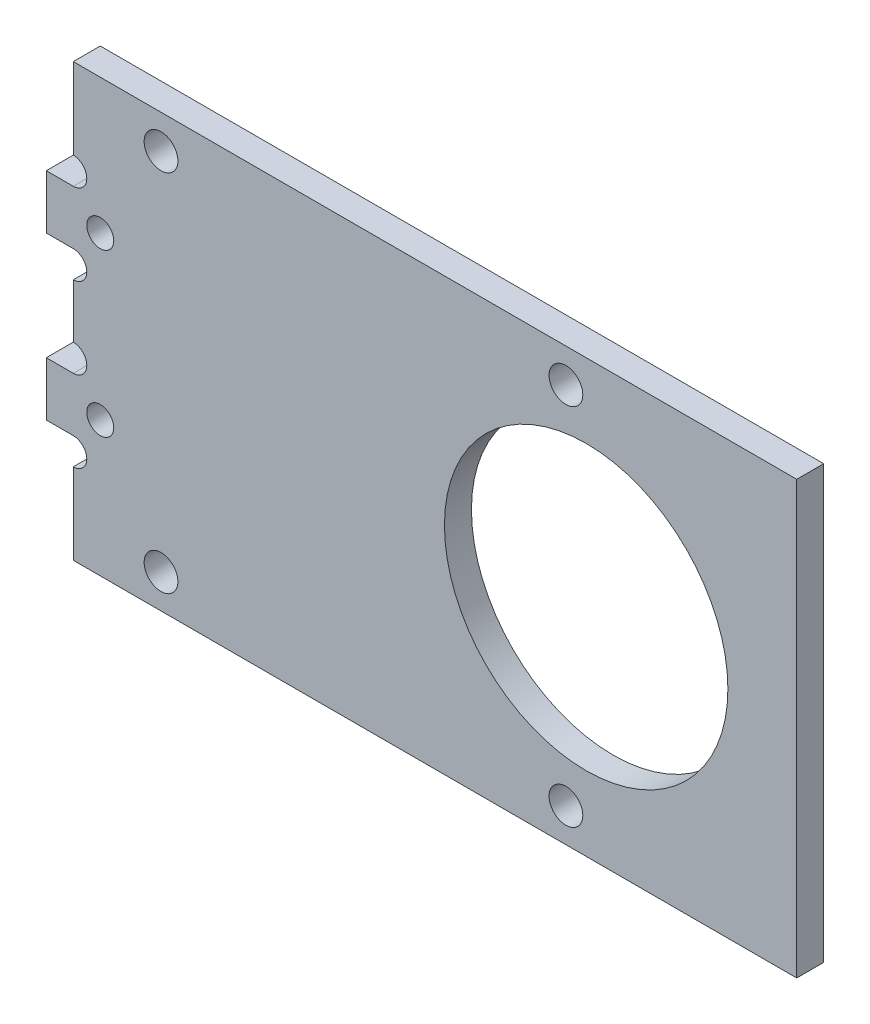
ISO-10303-21;
HEADER;
FILE_DESCRIPTION(('STEP AP214'),'2;1');
FILE_NAME('part.step','',(''),(''),'','','');
FILE_SCHEMA(('AUTOMOTIVE_DESIGN { 1 0 10303 214 1 1 1 1 }'));
ENDSEC;
DATA;
#1=APPLICATION_CONTEXT('core data for automotive mechanical design processes');
#2=APPLICATION_PROTOCOL_DEFINITION('international standard','automotive_design',2000,#1);
#3=PRODUCT_CONTEXT('',#1,'mechanical');
#4=PRODUCT('Part','Part','',(#3));
#5=PRODUCT_RELATED_PRODUCT_CATEGORY('part','',(#4));
#6=PRODUCT_DEFINITION_FORMATION('','',#4);
#7=PRODUCT_DEFINITION_CONTEXT('part definition',#1,'design');
#8=PRODUCT_DEFINITION('design','',#6,#7);
#9=PRODUCT_DEFINITION_SHAPE('','',#8);
#10=(LENGTH_UNIT() NAMED_UNIT(*) SI_UNIT(.MILLI.,.METRE.));
#11=(NAMED_UNIT(*) PLANE_ANGLE_UNIT() SI_UNIT($,.RADIAN.));
#12=(NAMED_UNIT(*) SI_UNIT($,.STERADIAN.) SOLID_ANGLE_UNIT());
#13=UNCERTAINTY_MEASURE_WITH_UNIT(LENGTH_MEASURE(1.E-05),#10,'distance_accuracy_value','');
#14=(GEOMETRIC_REPRESENTATION_CONTEXT(3) GLOBAL_UNCERTAINTY_ASSIGNED_CONTEXT((#13)) GLOBAL_UNIT_ASSIGNED_CONTEXT((#10,
#11,#12)) REPRESENTATION_CONTEXT('',''));
#15=CARTESIAN_POINT('',(0.,0.,0.));
#16=DIRECTION('',(0.,0.,1.));
#17=DIRECTION('',(1.,0.,0.));
#18=AXIS2_PLACEMENT_3D('',#15,#16,#17);
#19=CARTESIAN_POINT('',(-8.86843463568494,-9.10629075351366,2.));
#20=DIRECTION('',(0.,0.,-1.));
#21=DIRECTION('',(-1.,0.,0.));
#22=AXIS2_PLACEMENT_3D('',#19,#20,#21);
#23=PLANE('',#22);
#24=DIRECTION('',(-1.,0.,0.));
#25=VECTOR('',#24,1.);
#26=CARTESIAN_POINT('',(-8.86843463568493,15.8937092464863,2.));
#27=LINE('',#26,#25);
#28=CARTESIAN_POINT('',(44.7315653643151,15.8937092464863,2.));
#29=VERTEX_POINT('',#28);
#30=CARTESIAN_POINT('',(-8.86843463568493,15.8937092464863,2.));
#31=VERTEX_POINT('',#30);
#32=EDGE_CURVE('E208',#29,#31,#27,.T.);
#33=ORIENTED_EDGE('',*,*,#32,.T.);
#34=DIRECTION('',(0.,-1.,0.));
#35=VECTOR('',#34,1.);
#36=CARTESIAN_POINT('',(-8.86843463568494,14.8937092464863,2.));
#37=LINE('',#36,#35);
#38=CARTESIAN_POINT('',(-8.86843463568494,9.89370924648633,2.));
#39=VERTEX_POINT('',#38);
#40=EDGE_CURVE('E112',#31,#39,#37,.T.);
#41=ORIENTED_EDGE('',*,*,#40,.T.);
#42=CARTESIAN_POINT('',(-8.86843463568494,8.89370924648634,2.));
#43=DIRECTION('',(0.,0.,-1.));
#44=DIRECTION('',(1.,0.,0.));
#45=AXIS2_PLACEMENT_3D('',#42,#43,#44);
#46=CIRCLE('',#45,1.);
#47=CARTESIAN_POINT('',(-8.86843463568494,7.89370924648634,2.));
#48=VERTEX_POINT('',#47);
#49=EDGE_CURVE('E248',#39,#48,#46,.T.);
#50=ORIENTED_EDGE('',*,*,#49,.T.);
#51=DIRECTION('',(-1.,0.,0.));
#52=VECTOR('',#51,1.);
#53=CARTESIAN_POINT('',(-8.86843463568494,7.89370924648634,2.));
#54=LINE('',#53,#52);
#55=CARTESIAN_POINT('',(-10.8684346356849,7.89370924648634,2.));
#56=VERTEX_POINT('',#55);
#57=EDGE_CURVE('E265',#48,#56,#54,.T.);
#58=ORIENTED_EDGE('',*,*,#57,.T.);
#59=DIRECTION('',(0.,-1.,0.));
#60=VECTOR('',#59,1.);
#61=CARTESIAN_POINT('',(-10.8684346356849,7.89370924648634,2.));
#62=LINE('',#61,#60);
#63=CARTESIAN_POINT('',(-10.8684346356849,3.89370924648634,2.));
#64=VERTEX_POINT('',#63);
#65=EDGE_CURVE('E262',#56,#64,#62,.T.);
#66=ORIENTED_EDGE('',*,*,#65,.T.);
#67=DIRECTION('',(1.,0.,0.));
#68=VECTOR('',#67,1.);
#69=CARTESIAN_POINT('',(-8.86843463568494,3.89370924648634,2.));
#70=LINE('',#69,#68);
#71=CARTESIAN_POINT('',(-8.86843463568494,3.89370924648634,2.));
#72=VERTEX_POINT('',#71);
#73=EDGE_CURVE('E264',#64,#72,#70,.T.);
#74=ORIENTED_EDGE('',*,*,#73,.T.);
#75=CARTESIAN_POINT('',(-8.86843463568494,2.89370924648634,2.));
#76=DIRECTION('',(0.,0.,-1.));
#77=DIRECTION('',(-1.,0.,0.));
#78=AXIS2_PLACEMENT_3D('',#75,#76,#77);
#79=CIRCLE('',#78,1.);
#80=CARTESIAN_POINT('',(-8.86843463568494,1.89370924648634,2.));
#81=VERTEX_POINT('',#80);
#82=EDGE_CURVE('E267',#72,#81,#79,.T.);
#83=ORIENTED_EDGE('',*,*,#82,.T.);
#84=DIRECTION('',(0.,-1.,0.));
#85=VECTOR('',#84,1.);
#86=CARTESIAN_POINT('',(-8.86843463568494,1.89370924648634,2.));
#87=LINE('',#86,#85);
#88=CARTESIAN_POINT('',(-8.86843463568494,-2.10629075351366,2.));
#89=VERTEX_POINT('',#88);
#90=EDGE_CURVE('E273',#81,#89,#87,.T.);
#91=ORIENTED_EDGE('',*,*,#90,.T.);
#92=CARTESIAN_POINT('',(-8.86843463568494,-3.10629075351366,2.));
#93=DIRECTION('',(0.,0.,-1.));
#94=DIRECTION('',(1.,0.,0.));
#95=AXIS2_PLACEMENT_3D('',#92,#93,#94);
#96=CIRCLE('',#95,1.);
#97=CARTESIAN_POINT('',(-8.86843463568494,-4.10629075351366,2.));
#98=VERTEX_POINT('',#97);
#99=EDGE_CURVE('E275',#89,#98,#96,.T.);
#100=ORIENTED_EDGE('',*,*,#99,.T.);
#101=DIRECTION('',(-1.,0.,0.));
#102=VECTOR('',#101,1.);
#103=CARTESIAN_POINT('',(-8.86843463568494,-4.10629075351366,2.));
#104=LINE('',#103,#102);
#105=CARTESIAN_POINT('',(-10.8684346356849,-4.10629075351366,2.));
#106=VERTEX_POINT('',#105);
#107=EDGE_CURVE('E277',#98,#106,#104,.T.);
#108=ORIENTED_EDGE('',*,*,#107,.T.);
#109=DIRECTION('',(0.,-1.,0.));
#110=VECTOR('',#109,1.);
#111=CARTESIAN_POINT('',(-10.8684346356849,-4.10629075351366,2.));
#112=LINE('',#111,#110);
#113=CARTESIAN_POINT('',(-10.8684346356849,-8.10629075351366,2.));
#114=VERTEX_POINT('',#113);
#115=EDGE_CURVE('E279',#106,#114,#112,.T.);
#116=ORIENTED_EDGE('',*,*,#115,.T.);
#117=DIRECTION('',(1.,0.,0.));
#118=VECTOR('',#117,1.);
#119=CARTESIAN_POINT('',(-8.86843463568494,-8.10629075351366,2.));
#120=LINE('',#119,#118);
#121=CARTESIAN_POINT('',(-8.86843463568494,-8.10629075351366,2.));
#122=VERTEX_POINT('',#121);
#123=EDGE_CURVE('E281',#114,#122,#120,.T.);
#124=ORIENTED_EDGE('',*,*,#123,.T.);
#125=CARTESIAN_POINT('',(-8.86843463568494,-9.10629075351366,2.));
#126=DIRECTION('',(0.,0.,-1.));
#127=DIRECTION('',(-1.,0.,0.));
#128=AXIS2_PLACEMENT_3D('',#125,#126,#127);
#129=CIRCLE('',#128,0.999999999999999);
#130=CARTESIAN_POINT('',(-8.86843463568494,-10.1062907535137,2.));
#131=VERTEX_POINT('',#130);
#132=EDGE_CURVE('E156',#122,#131,#129,.T.);
#133=ORIENTED_EDGE('',*,*,#132,.T.);
#134=DIRECTION('',(0.,-1.,0.));
#135=VECTOR('',#134,1.);
#136=CARTESIAN_POINT('',(-8.86843463568494,-10.1062907535137,2.));
#137=LINE('',#136,#135);
#138=CARTESIAN_POINT('',(-8.86843463568493,-16.1062907535137,2.));
#139=VERTEX_POINT('',#138);
#140=EDGE_CURVE('E149',#131,#139,#137,.T.);
#141=ORIENTED_EDGE('',*,*,#140,.T.);
#142=DIRECTION('',(1.,0.,0.));
#143=VECTOR('',#142,1.);
#144=CARTESIAN_POINT('',(-8.86843463568493,-16.1062907535137,2.));
#145=LINE('',#144,#143);
#146=CARTESIAN_POINT('',(44.7315653643151,-16.1062907535137,2.));
#147=VERTEX_POINT('',#146);
#148=EDGE_CURVE('E153',#139,#147,#145,.T.);
#149=ORIENTED_EDGE('',*,*,#148,.T.);
#150=DIRECTION('',(0.,1.,0.));
#151=VECTOR('',#150,1.);
#152=CARTESIAN_POINT('',(44.7315653643151,-15.1062907535137,2.));
#153=LINE('',#152,#151);
#154=EDGE_CURVE('E49',#147,#29,#153,.T.);
#155=ORIENTED_EDGE('',*,*,#154,.T.);
#156=EDGE_LOOP('',(#33,#41,#50,#58,#66,#74,#83,#91,#100,#108,#116,#124,#133,#141,#149,#155));
#157=FACE_BOUND('',#156,.T.);
#158=CARTESIAN_POINT('',(-6.86843463568493,5.89370924648634,2.));
#159=DIRECTION('',(0.,0.,1.));
#160=DIRECTION('',(1.,0.,0.));
#161=AXIS2_PLACEMENT_3D('',#158,#159,#160);
#162=CIRCLE('',#161,1.);
#163=CARTESIAN_POINT('',(-5.86843463568493,5.89370924648634,2.));
#164=VERTEX_POINT('',#163);
#165=EDGE_CURVE('E180',#164,#164,#162,.T.);
#166=ORIENTED_EDGE('',*,*,#165,.F.);
#167=EDGE_LOOP('',(#166));
#168=FACE_BOUND('',#167,.T.);
#169=CARTESIAN_POINT('',(29.1315653643151,-0.106290753513656,2.));
#170=DIRECTION('',(0.,0.,1.));
#171=DIRECTION('',(1.,0.,0.));
#172=AXIS2_PLACEMENT_3D('',#169,#170,#171);
#173=CIRCLE('',#172,10.5);
#174=CARTESIAN_POINT('',(39.6315653643151,-0.106290753513656,2.));
#175=VERTEX_POINT('',#174);
#176=EDGE_CURVE('E305',#175,#175,#173,.T.);
#177=ORIENTED_EDGE('',*,*,#176,.F.);
#178=EDGE_LOOP('',(#177));
#179=FACE_BOUND('',#178,.T.);
#180=CARTESIAN_POINT('',(-6.86843463568493,-6.10629075351366,2.));
#181=DIRECTION('',(0.,0.,1.));
#182=DIRECTION('',(1.,0.,0.));
#183=AXIS2_PLACEMENT_3D('',#180,#181,#182);
#184=CIRCLE('',#183,1.);
#185=CARTESIAN_POINT('',(-5.86843463568493,-6.10629075351366,2.));
#186=VERTEX_POINT('',#185);
#187=EDGE_CURVE('E311',#186,#186,#184,.T.);
#188=ORIENTED_EDGE('',*,*,#187,.F.);
#189=EDGE_LOOP('',(#188));
#190=FACE_BOUND('',#189,.T.);
#191=CARTESIAN_POINT('',(-2.36843463568494,13.3937092464863,2.));
#192=DIRECTION('',(0.,0.,1.));
#193=DIRECTION('',(1.,0.,0.));
#194=AXIS2_PLACEMENT_3D('',#191,#192,#193);
#195=CIRCLE('',#194,1.25);
#196=CARTESIAN_POINT('',(-1.11843463568494,13.3937092464863,2.));
#197=VERTEX_POINT('',#196);
#198=EDGE_CURVE('E317',#197,#197,#195,.T.);
#199=ORIENTED_EDGE('',*,*,#198,.F.);
#200=EDGE_LOOP('',(#199));
#201=FACE_BOUND('',#200,.T.);
#202=CARTESIAN_POINT('',(-2.36843463568493,-13.6062907535137,2.));
#203=DIRECTION('',(0.,0.,1.));
#204=DIRECTION('',(1.,0.,0.));
#205=AXIS2_PLACEMENT_3D('',#202,#203,#204);
#206=CIRCLE('',#205,1.25);
#207=CARTESIAN_POINT('',(-1.11843463568493,-13.6062907535137,2.));
#208=VERTEX_POINT('',#207);
#209=EDGE_CURVE('E323',#208,#208,#206,.T.);
#210=ORIENTED_EDGE('',*,*,#209,.F.);
#211=EDGE_LOOP('',(#210));
#212=FACE_BOUND('',#211,.T.);
#213=CARTESIAN_POINT('',(27.6315653643151,13.3937092464863,2.));
#214=DIRECTION('',(0.,0.,1.));
#215=DIRECTION('',(1.,0.,0.));
#216=AXIS2_PLACEMENT_3D('',#213,#214,#215);
#217=CIRCLE('',#216,1.25);
#218=CARTESIAN_POINT('',(28.8815653643151,13.3937092464863,2.));
#219=VERTEX_POINT('',#218);
#220=EDGE_CURVE('E329',#219,#219,#217,.T.);
#221=ORIENTED_EDGE('',*,*,#220,.F.);
#222=EDGE_LOOP('',(#221));
#223=FACE_BOUND('',#222,.T.);
#224=CARTESIAN_POINT('',(27.6315653643151,-13.6062907535137,2.));
#225=DIRECTION('',(0.,0.,1.));
#226=DIRECTION('',(1.,0.,0.));
#227=AXIS2_PLACEMENT_3D('',#224,#225,#226);
#228=CIRCLE('',#227,1.25);
#229=CARTESIAN_POINT('',(28.8815653643151,-13.6062907535137,2.));
#230=VERTEX_POINT('',#229);
#231=EDGE_CURVE('E335',#230,#230,#228,.T.);
#232=ORIENTED_EDGE('',*,*,#231,.F.);
#233=EDGE_LOOP('',(#232));
#234=FACE_BOUND('',#233,.T.);
#235=ADVANCED_FACE('F32',(#157,#168,#179,#190,#201,#212,#223,#234),#23,.F.);
#236=CARTESIAN_POINT('',(-8.86843463568494,-9.10629075351366,0.));
#237=DIRECTION('',(0.,0.,-1.));
#238=DIRECTION('',(-1.,0.,0.));
#239=AXIS2_PLACEMENT_3D('',#236,#237,#238);
#240=PLANE('',#239);
#241=CARTESIAN_POINT('',(27.6315653643151,13.3937092464863,0.));
#242=DIRECTION('',(0.,0.,1.));
#243=DIRECTION('',(1.,0.,0.));
#244=AXIS2_PLACEMENT_3D('',#241,#242,#243);
#245=CIRCLE('',#244,1.25);
#246=CARTESIAN_POINT('',(28.8815653643151,13.3937092464863,0.));
#247=VERTEX_POINT('',#246);
#248=EDGE_CURVE('E332',#247,#247,#245,.T.);
#249=ORIENTED_EDGE('',*,*,#248,.T.);
#250=EDGE_LOOP('',(#249));
#251=FACE_BOUND('',#250,.T.);
#252=CARTESIAN_POINT('',(-2.36843463568494,13.3937092464863,0.));
#253=DIRECTION('',(0.,0.,1.));
#254=DIRECTION('',(1.,0.,0.));
#255=AXIS2_PLACEMENT_3D('',#252,#253,#254);
#256=CIRCLE('',#255,1.25);
#257=CARTESIAN_POINT('',(-1.11843463568494,13.3937092464863,0.));
#258=VERTEX_POINT('',#257);
#259=EDGE_CURVE('E320',#258,#258,#256,.T.);
#260=ORIENTED_EDGE('',*,*,#259,.T.);
#261=EDGE_LOOP('',(#260));
#262=FACE_BOUND('',#261,.T.);
#263=CARTESIAN_POINT('',(29.1315653643151,-0.106290753513656,0.));
#264=DIRECTION('',(0.,0.,1.));
#265=DIRECTION('',(1.,0.,0.));
#266=AXIS2_PLACEMENT_3D('',#263,#264,#265);
#267=CIRCLE('',#266,10.5);
#268=CARTESIAN_POINT('',(39.6315653643151,-0.106290753513656,0.));
#269=VERTEX_POINT('',#268);
#270=EDGE_CURVE('E308',#269,#269,#267,.T.);
#271=ORIENTED_EDGE('',*,*,#270,.T.);
#272=EDGE_LOOP('',(#271));
#273=FACE_BOUND('',#272,.T.);
#274=DIRECTION('',(0.,-1.,0.));
#275=VECTOR('',#274,1.);
#276=CARTESIAN_POINT('',(-8.86843463568494,14.8937092464863,0.));
#277=LINE('',#276,#275);
#278=CARTESIAN_POINT('',(-8.86843463568493,15.8937092464863,0.));
#279=VERTEX_POINT('',#278);
#280=CARTESIAN_POINT('',(-8.86843463568494,9.89370924648633,0.));
#281=VERTEX_POINT('',#280);
#282=EDGE_CURVE('E177',#279,#281,#277,.T.);
#283=ORIENTED_EDGE('',*,*,#282,.F.);
#284=DIRECTION('',(-1.,0.,0.));
#285=VECTOR('',#284,1.);
#286=CARTESIAN_POINT('',(-7.86843463568494,15.8937092464863,0.));
#287=LINE('',#286,#285);
#288=CARTESIAN_POINT('',(44.7315653643151,15.8937092464863,0.));
#289=VERTEX_POINT('',#288);
#290=EDGE_CURVE('E105',#289,#279,#287,.T.);
#291=ORIENTED_EDGE('',*,*,#290,.F.);
#292=DIRECTION('',(0.,1.,0.));
#293=VECTOR('',#292,1.);
#294=CARTESIAN_POINT('',(44.7315653643151,14.8937092464863,0.));
#295=LINE('',#294,#293);
#296=CARTESIAN_POINT('',(44.7315653643151,-16.1062907535137,0.));
#297=VERTEX_POINT('',#296);
#298=EDGE_CURVE('E101',#297,#289,#295,.T.);
#299=ORIENTED_EDGE('',*,*,#298,.F.);
#300=DIRECTION('',(1.,0.,0.));
#301=VECTOR('',#300,1.);
#302=CARTESIAN_POINT('',(44.7315653643151,-16.1062907535137,0.));
#303=LINE('',#302,#301);
#304=CARTESIAN_POINT('',(-8.86843463568493,-16.1062907535137,0.));
#305=VERTEX_POINT('',#304);
#306=EDGE_CURVE('E204',#305,#297,#303,.T.);
#307=ORIENTED_EDGE('',*,*,#306,.F.);
#308=DIRECTION('',(0.,-1.,0.));
#309=VECTOR('',#308,1.);
#310=CARTESIAN_POINT('',(-8.86843463568493,-15.1062907535137,0.));
#311=LINE('',#310,#309);
#312=CARTESIAN_POINT('',(-8.86843463568494,-10.1062907535137,0.));
#313=VERTEX_POINT('',#312);
#314=EDGE_CURVE('E165',#313,#305,#311,.T.);
#315=ORIENTED_EDGE('',*,*,#314,.F.);
#316=CARTESIAN_POINT('',(-8.86843463568494,-9.10629075351366,0.));
#317=DIRECTION('',(0.,0.,-1.));
#318=DIRECTION('',(-1.,0.,0.));
#319=AXIS2_PLACEMENT_3D('',#316,#317,#318);
#320=CIRCLE('',#319,0.999999999999999);
#321=CARTESIAN_POINT('',(-8.86843463568494,-8.10629075351366,0.));
#322=VERTEX_POINT('',#321);
#323=EDGE_CURVE('E200',#322,#313,#320,.T.);
#324=ORIENTED_EDGE('',*,*,#323,.F.);
#325=DIRECTION('',(1.,0.,0.));
#326=VECTOR('',#325,1.);
#327=CARTESIAN_POINT('',(-8.86843463568494,-8.10629075351366,0.));
#328=LINE('',#327,#326);
#329=CARTESIAN_POINT('',(-10.8684346356849,-8.10629075351366,0.));
#330=VERTEX_POINT('',#329);
#331=EDGE_CURVE('E198',#330,#322,#328,.T.);
#332=ORIENTED_EDGE('',*,*,#331,.F.);
#333=DIRECTION('',(0.,-1.,0.));
#334=VECTOR('',#333,1.);
#335=CARTESIAN_POINT('',(-10.8684346356849,-4.10629075351366,0.));
#336=LINE('',#335,#334);
#337=CARTESIAN_POINT('',(-10.8684346356849,-4.10629075351366,0.));
#338=VERTEX_POINT('',#337);
#339=EDGE_CURVE('E196',#338,#330,#336,.T.);
#340=ORIENTED_EDGE('',*,*,#339,.F.);
#341=DIRECTION('',(-1.,0.,0.));
#342=VECTOR('',#341,1.);
#343=CARTESIAN_POINT('',(-8.86843463568494,-4.10629075351366,0.));
#344=LINE('',#343,#342);
#345=CARTESIAN_POINT('',(-8.86843463568494,-4.10629075351366,0.));
#346=VERTEX_POINT('',#345);
#347=EDGE_CURVE('E194',#346,#338,#344,.T.);
#348=ORIENTED_EDGE('',*,*,#347,.F.);
#349=CARTESIAN_POINT('',(-8.86843463568494,-3.10629075351366,0.));
#350=DIRECTION('',(0.,0.,-1.));
#351=DIRECTION('',(1.,0.,0.));
#352=AXIS2_PLACEMENT_3D('',#349,#350,#351);
#353=CIRCLE('',#352,1.);
#354=CARTESIAN_POINT('',(-8.86843463568494,-2.10629075351366,0.));
#355=VERTEX_POINT('',#354);
#356=EDGE_CURVE('E192',#355,#346,#353,.T.);
#357=ORIENTED_EDGE('',*,*,#356,.F.);
#358=DIRECTION('',(0.,-1.,0.));
#359=VECTOR('',#358,1.);
#360=CARTESIAN_POINT('',(-8.86843463568494,1.89370924648634,0.));
#361=LINE('',#360,#359);
#362=CARTESIAN_POINT('',(-8.86843463568494,1.89370924648634,0.));
#363=VERTEX_POINT('',#362);
#364=EDGE_CURVE('E190',#363,#355,#361,.T.);
#365=ORIENTED_EDGE('',*,*,#364,.F.);
#366=CARTESIAN_POINT('',(-8.86843463568494,2.89370924648634,0.));
#367=DIRECTION('',(0.,0.,-1.));
#368=DIRECTION('',(-1.,0.,0.));
#369=AXIS2_PLACEMENT_3D('',#366,#367,#368);
#370=CIRCLE('',#369,1.);
#371=CARTESIAN_POINT('',(-8.86843463568494,3.89370924648634,0.));
#372=VERTEX_POINT('',#371);
#373=EDGE_CURVE('E188',#372,#363,#370,.T.);
#374=ORIENTED_EDGE('',*,*,#373,.F.);
#375=DIRECTION('',(1.,0.,0.));
#376=VECTOR('',#375,1.);
#377=CARTESIAN_POINT('',(-8.86843463568494,3.89370924648634,0.));
#378=LINE('',#377,#376);
#379=CARTESIAN_POINT('',(-10.8684346356849,3.89370924648634,0.));
#380=VERTEX_POINT('',#379);
#381=EDGE_CURVE('E186',#380,#372,#378,.T.);
#382=ORIENTED_EDGE('',*,*,#381,.F.);
#383=DIRECTION('',(0.,-1.,0.));
#384=VECTOR('',#383,1.);
#385=CARTESIAN_POINT('',(-10.8684346356849,7.89370924648634,0.));
#386=LINE('',#385,#384);
#387=CARTESIAN_POINT('',(-10.8684346356849,7.89370924648634,0.));
#388=VERTEX_POINT('',#387);
#389=EDGE_CURVE('E184',#388,#380,#386,.T.);
#390=ORIENTED_EDGE('',*,*,#389,.F.);
#391=DIRECTION('',(-1.,0.,0.));
#392=VECTOR('',#391,1.);
#393=CARTESIAN_POINT('',(-8.86843463568494,7.89370924648634,0.));
#394=LINE('',#393,#392);
#395=CARTESIAN_POINT('',(-8.86843463568494,7.89370924648634,0.));
#396=VERTEX_POINT('',#395);
#397=EDGE_CURVE('E182',#396,#388,#394,.T.);
#398=ORIENTED_EDGE('',*,*,#397,.F.);
#399=CARTESIAN_POINT('',(-8.86843463568494,8.89370924648634,0.));
#400=DIRECTION('',(0.,0.,-1.));
#401=DIRECTION('',(1.,0.,0.));
#402=AXIS2_PLACEMENT_3D('',#399,#400,#401);
#403=CIRCLE('',#402,1.);
#404=EDGE_CURVE('E179',#281,#396,#403,.T.);
#405=ORIENTED_EDGE('',*,*,#404,.F.);
#406=EDGE_LOOP('',(#283,#291,#299,#307,#315,#324,#332,#340,#348,#357,#365,#374,#382,#390,#398,#405));
#407=FACE_BOUND('',#406,.T.);
#408=CARTESIAN_POINT('',(-6.86843463568493,5.89370924648634,0.));
#409=DIRECTION('',(0.,0.,1.));
#410=DIRECTION('',(1.,0.,0.));
#411=AXIS2_PLACEMENT_3D('',#408,#409,#410);
#412=CIRCLE('',#411,1.);
#413=CARTESIAN_POINT('',(-5.86843463568493,5.89370924648634,0.));
#414=VERTEX_POINT('',#413);
#415=EDGE_CURVE('E302',#414,#414,#412,.T.);
#416=ORIENTED_EDGE('',*,*,#415,.T.);
#417=EDGE_LOOP('',(#416));
#418=FACE_BOUND('',#417,.T.);
#419=CARTESIAN_POINT('',(-6.86843463568493,-6.10629075351366,0.));
#420=DIRECTION('',(0.,0.,1.));
#421=DIRECTION('',(1.,0.,0.));
#422=AXIS2_PLACEMENT_3D('',#419,#420,#421);
#423=CIRCLE('',#422,1.);
#424=CARTESIAN_POINT('',(-5.86843463568493,-6.10629075351366,0.));
#425=VERTEX_POINT('',#424);
#426=EDGE_CURVE('E314',#425,#425,#423,.T.);
#427=ORIENTED_EDGE('',*,*,#426,.T.);
#428=EDGE_LOOP('',(#427));
#429=FACE_BOUND('',#428,.T.);
#430=CARTESIAN_POINT('',(-2.36843463568493,-13.6062907535137,0.));
#431=DIRECTION('',(0.,0.,1.));
#432=DIRECTION('',(1.,0.,0.));
#433=AXIS2_PLACEMENT_3D('',#430,#431,#432);
#434=CIRCLE('',#433,1.25);
#435=CARTESIAN_POINT('',(-1.11843463568493,-13.6062907535137,0.));
#436=VERTEX_POINT('',#435);
#437=EDGE_CURVE('E326',#436,#436,#434,.T.);
#438=ORIENTED_EDGE('',*,*,#437,.T.);
#439=EDGE_LOOP('',(#438));
#440=FACE_BOUND('',#439,.T.);
#441=CARTESIAN_POINT('',(27.6315653643151,-13.6062907535137,0.));
#442=DIRECTION('',(0.,0.,1.));
#443=DIRECTION('',(1.,0.,0.));
#444=AXIS2_PLACEMENT_3D('',#441,#442,#443);
#445=CIRCLE('',#444,1.25);
#446=CARTESIAN_POINT('',(28.8815653643151,-13.6062907535137,0.));
#447=VERTEX_POINT('',#446);
#448=EDGE_CURVE('E338',#447,#447,#445,.T.);
#449=ORIENTED_EDGE('',*,*,#448,.T.);
#450=EDGE_LOOP('',(#449));
#451=FACE_BOUND('',#450,.T.);
#452=ADVANCED_FACE('F250',(#251,#262,#273,#407,#418,#429,#440,#451),#240,.T.);
#453=CARTESIAN_POINT('',(-8.86843463568494,14.8937092464863,2.));
#454=DIRECTION('',(1.,0.,0.));
#455=DIRECTION('',(0.,0.,-1.));
#456=AXIS2_PLACEMENT_3D('',#453,#454,#455);
#457=PLANE('',#456);
#458=ORIENTED_EDGE('',*,*,#282,.T.);
#459=DIRECTION('',(0.,0.,-1.));
#460=VECTOR('',#459,1.);
#461=CARTESIAN_POINT('',(-8.86843463568494,9.89370924648633,2.));
#462=LINE('',#461,#460);
#463=EDGE_CURVE('E41',#39,#281,#462,.T.);
#464=ORIENTED_EDGE('',*,*,#463,.F.);
#465=ORIENTED_EDGE('',*,*,#40,.F.);
#466=DIRECTION('',(0.,0.,-1.));
#467=VECTOR('',#466,1.);
#468=CARTESIAN_POINT('',(-8.86843463568493,15.8937092464863,2.));
#469=LINE('',#468,#467);
#470=EDGE_CURVE('E11',#31,#279,#469,.T.);
#471=ORIENTED_EDGE('',*,*,#470,.T.);
#472=EDGE_LOOP('',(#458,#464,#465,#471));
#473=FACE_BOUND('',#472,.T.);
#474=ADVANCED_FACE('F34',(#473),#457,.F.);
#475=CARTESIAN_POINT('',(-8.86843463568494,8.89370924648634,2.));
#476=DIRECTION('',(0.,0.,-1.));
#477=DIRECTION('',(-1.,0.,0.));
#478=AXIS2_PLACEMENT_3D('',#475,#476,#477);
#479=CYLINDRICAL_SURFACE('',#478,1.);
#480=ORIENTED_EDGE('',*,*,#404,.T.);
#481=DIRECTION('',(0.,0.,-1.));
#482=VECTOR('',#481,1.);
#483=CARTESIAN_POINT('',(-8.86843463568494,7.89370924648634,2.));
#484=LINE('',#483,#482);
#485=EDGE_CURVE('E240',#48,#396,#484,.T.);
#486=ORIENTED_EDGE('',*,*,#485,.F.);
#487=ORIENTED_EDGE('',*,*,#49,.F.);
#488=ORIENTED_EDGE('',*,*,#463,.T.);
#489=EDGE_LOOP('',(#480,#486,#487,#488));
#490=FACE_BOUND('',#489,.T.);
#491=ADVANCED_FACE('F246',(#490),#479,.F.);
#492=CARTESIAN_POINT('',(-8.86843463568494,7.89370924648634,2.));
#493=DIRECTION('',(0.,-1.,0.));
#494=DIRECTION('',(0.,0.,-1.));
#495=AXIS2_PLACEMENT_3D('',#492,#493,#494);
#496=PLANE('',#495);
#497=ORIENTED_EDGE('',*,*,#397,.T.);
#498=DIRECTION('',(0.,0.,-1.));
#499=VECTOR('',#498,1.);
#500=CARTESIAN_POINT('',(-10.8684346356849,7.89370924648634,2.));
#501=LINE('',#500,#499);
#502=EDGE_CURVE('E237',#56,#388,#501,.T.);
#503=ORIENTED_EDGE('',*,*,#502,.F.);
#504=ORIENTED_EDGE('',*,*,#57,.F.);
#505=ORIENTED_EDGE('',*,*,#485,.T.);
#506=EDGE_LOOP('',(#497,#503,#504,#505));
#507=FACE_BOUND('',#506,.T.);
#508=ADVANCED_FACE('F256',(#507),#496,.F.);
#509=CARTESIAN_POINT('',(-10.8684346356849,7.89370924648634,2.));
#510=DIRECTION('',(1.,0.,0.));
#511=DIRECTION('',(0.,0.,-1.));
#512=AXIS2_PLACEMENT_3D('',#509,#510,#511);
#513=PLANE('',#512);
#514=ORIENTED_EDGE('',*,*,#389,.T.);
#515=DIRECTION('',(0.,0.,-1.));
#516=VECTOR('',#515,1.);
#517=CARTESIAN_POINT('',(-10.8684346356849,3.89370924648634,2.));
#518=LINE('',#517,#516);
#519=EDGE_CURVE('E234',#64,#380,#518,.T.);
#520=ORIENTED_EDGE('',*,*,#519,.F.);
#521=ORIENTED_EDGE('',*,*,#65,.F.);
#522=ORIENTED_EDGE('',*,*,#502,.T.);
#523=EDGE_LOOP('',(#514,#520,#521,#522));
#524=FACE_BOUND('',#523,.T.);
#525=ADVANCED_FACE('F260',(#524),#513,.F.);
#526=CARTESIAN_POINT('',(-8.86843463568494,3.89370924648634,2.));
#527=DIRECTION('',(0.,1.,0.));
#528=DIRECTION('',(-1.,0.,0.));
#529=AXIS2_PLACEMENT_3D('',#526,#527,#528);
#530=PLANE('',#529);
#531=ORIENTED_EDGE('',*,*,#381,.T.);
#532=DIRECTION('',(0.,0.,-1.));
#533=VECTOR('',#532,1.);
#534=CARTESIAN_POINT('',(-8.86843463568494,3.89370924648634,2.));
#535=LINE('',#534,#533);
#536=EDGE_CURVE('E231',#72,#372,#535,.T.);
#537=ORIENTED_EDGE('',*,*,#536,.F.);
#538=ORIENTED_EDGE('',*,*,#73,.F.);
#539=ORIENTED_EDGE('',*,*,#519,.T.);
#540=EDGE_LOOP('',(#531,#537,#538,#539));
#541=FACE_BOUND('',#540,.T.);
#542=ADVANCED_FACE('F389',(#541),#530,.F.);
#543=CARTESIAN_POINT('',(-8.86843463568494,2.89370924648634,2.));
#544=DIRECTION('',(0.,0.,-1.));
#545=DIRECTION('',(-1.,0.,0.));
#546=AXIS2_PLACEMENT_3D('',#543,#544,#545);
#547=CYLINDRICAL_SURFACE('',#546,1.);
#548=ORIENTED_EDGE('',*,*,#373,.T.);
#549=DIRECTION('',(0.,0.,-1.));
#550=VECTOR('',#549,1.);
#551=CARTESIAN_POINT('',(-8.86843463568494,1.89370924648634,2.));
#552=LINE('',#551,#550);
#553=EDGE_CURVE('E228',#81,#363,#552,.T.);
#554=ORIENTED_EDGE('',*,*,#553,.F.);
#555=ORIENTED_EDGE('',*,*,#82,.F.);
#556=ORIENTED_EDGE('',*,*,#536,.T.);
#557=EDGE_LOOP('',(#548,#554,#555,#556));
#558=FACE_BOUND('',#557,.T.);
#559=ADVANCED_FACE('F385',(#558),#547,.F.);
#560=CARTESIAN_POINT('',(-8.86843463568494,1.89370924648634,2.));
#561=DIRECTION('',(1.,0.,0.));
#562=DIRECTION('',(0.,0.,-1.));
#563=AXIS2_PLACEMENT_3D('',#560,#561,#562);
#564=PLANE('',#563);
#565=ORIENTED_EDGE('',*,*,#364,.T.);
#566=DIRECTION('',(0.,0.,-1.));
#567=VECTOR('',#566,1.);
#568=CARTESIAN_POINT('',(-8.86843463568494,-2.10629075351366,2.));
#569=LINE('',#568,#567);
#570=EDGE_CURVE('E225',#89,#355,#569,.T.);
#571=ORIENTED_EDGE('',*,*,#570,.F.);
#572=ORIENTED_EDGE('',*,*,#90,.F.);
#573=ORIENTED_EDGE('',*,*,#553,.T.);
#574=EDGE_LOOP('',(#565,#571,#572,#573));
#575=FACE_BOUND('',#574,.T.);
#576=ADVANCED_FACE('F381',(#575),#564,.F.);
#577=CARTESIAN_POINT('',(-8.86843463568494,-3.10629075351366,2.));
#578=DIRECTION('',(0.,0.,-1.));
#579=DIRECTION('',(-1.,0.,0.));
#580=AXIS2_PLACEMENT_3D('',#577,#578,#579);
#581=CYLINDRICAL_SURFACE('',#580,1.);
#582=ORIENTED_EDGE('',*,*,#356,.T.);
#583=DIRECTION('',(0.,0.,-1.));
#584=VECTOR('',#583,1.);
#585=CARTESIAN_POINT('',(-8.86843463568494,-4.10629075351366,2.));
#586=LINE('',#585,#584);
#587=EDGE_CURVE('E222',#98,#346,#586,.T.);
#588=ORIENTED_EDGE('',*,*,#587,.F.);
#589=ORIENTED_EDGE('',*,*,#99,.F.);
#590=ORIENTED_EDGE('',*,*,#570,.T.);
#591=EDGE_LOOP('',(#582,#588,#589,#590));
#592=FACE_BOUND('',#591,.T.);
#593=ADVANCED_FACE('F377',(#592),#581,.F.);
#594=CARTESIAN_POINT('',(-8.86843463568494,-4.10629075351366,2.));
#595=DIRECTION('',(0.,-1.,0.));
#596=DIRECTION('',(0.,0.,-1.));
#597=AXIS2_PLACEMENT_3D('',#594,#595,#596);
#598=PLANE('',#597);
#599=ORIENTED_EDGE('',*,*,#347,.T.);
#600=DIRECTION('',(0.,0.,-1.));
#601=VECTOR('',#600,1.);
#602=CARTESIAN_POINT('',(-10.8684346356849,-4.10629075351366,2.));
#603=LINE('',#602,#601);
#604=EDGE_CURVE('E219',#106,#338,#603,.T.);
#605=ORIENTED_EDGE('',*,*,#604,.F.);
#606=ORIENTED_EDGE('',*,*,#107,.F.);
#607=ORIENTED_EDGE('',*,*,#587,.T.);
#608=EDGE_LOOP('',(#599,#605,#606,#607));
#609=FACE_BOUND('',#608,.T.);
#610=ADVANCED_FACE('F373',(#609),#598,.F.);
#611=CARTESIAN_POINT('',(-10.8684346356849,-4.10629075351366,2.));
#612=DIRECTION('',(1.,0.,0.));
#613=DIRECTION('',(0.,0.,-1.));
#614=AXIS2_PLACEMENT_3D('',#611,#612,#613);
#615=PLANE('',#614);
#616=ORIENTED_EDGE('',*,*,#339,.T.);
#617=DIRECTION('',(0.,0.,-1.));
#618=VECTOR('',#617,1.);
#619=CARTESIAN_POINT('',(-10.8684346356849,-8.10629075351366,2.));
#620=LINE('',#619,#618);
#621=EDGE_CURVE('E216',#114,#330,#620,.T.);
#622=ORIENTED_EDGE('',*,*,#621,.F.);
#623=ORIENTED_EDGE('',*,*,#115,.F.);
#624=ORIENTED_EDGE('',*,*,#604,.T.);
#625=EDGE_LOOP('',(#616,#622,#623,#624));
#626=FACE_BOUND('',#625,.T.);
#627=ADVANCED_FACE('F370',(#626),#615,.F.);
#628=CARTESIAN_POINT('',(-8.86843463568494,-8.10629075351366,2.));
#629=DIRECTION('',(0.,1.,0.));
#630=DIRECTION('',(0.,0.,1.));
#631=AXIS2_PLACEMENT_3D('',#628,#629,#630);
#632=PLANE('',#631);
#633=ORIENTED_EDGE('',*,*,#331,.T.);
#634=DIRECTION('',(0.,0.,-1.));
#635=VECTOR('',#634,1.);
#636=CARTESIAN_POINT('',(-8.86843463568494,-8.10629075351366,2.));
#637=LINE('',#636,#635);
#638=EDGE_CURVE('E213',#122,#322,#637,.T.);
#639=ORIENTED_EDGE('',*,*,#638,.F.);
#640=ORIENTED_EDGE('',*,*,#123,.F.);
#641=ORIENTED_EDGE('',*,*,#621,.T.);
#642=EDGE_LOOP('',(#633,#639,#640,#641));
#643=FACE_BOUND('',#642,.T.);
#644=ADVANCED_FACE('F287',(#643),#632,.F.);
#645=CARTESIAN_POINT('',(-8.86843463568494,-9.10629075351366,2.));
#646=DIRECTION('',(0.,0.,-1.));
#647=DIRECTION('',(-1.,0.,0.));
#648=AXIS2_PLACEMENT_3D('',#645,#646,#647);
#649=CYLINDRICAL_SURFACE('',#648,0.999999999999999);
#650=ORIENTED_EDGE('',*,*,#323,.T.);
#651=DIRECTION('',(0.,0.,-1.));
#652=VECTOR('',#651,1.);
#653=CARTESIAN_POINT('',(-8.86843463568494,-10.1062907535137,2.));
#654=LINE('',#653,#652);
#655=EDGE_CURVE('E167',#131,#313,#654,.T.);
#656=ORIENTED_EDGE('',*,*,#655,.F.);
#657=ORIENTED_EDGE('',*,*,#132,.F.);
#658=ORIENTED_EDGE('',*,*,#638,.T.);
#659=EDGE_LOOP('',(#650,#656,#657,#658));
#660=FACE_BOUND('',#659,.T.);
#661=ADVANCED_FACE('F291',(#660),#649,.F.);
#662=CARTESIAN_POINT('',(-8.86843463568493,-15.1062907535137,2.));
#663=DIRECTION('',(1.,0.,0.));
#664=DIRECTION('',(0.,1.,0.));
#665=AXIS2_PLACEMENT_3D('',#662,#663,#664);
#666=PLANE('',#665);
#667=ORIENTED_EDGE('',*,*,#314,.T.);
#668=DIRECTION('',(0.,0.,-1.));
#669=VECTOR('',#668,1.);
#670=CARTESIAN_POINT('',(-8.86843463568493,-16.1062907535137,2.));
#671=LINE('',#670,#669);
#672=EDGE_CURVE('E163',#139,#305,#671,.T.);
#673=ORIENTED_EDGE('',*,*,#672,.F.);
#674=ORIENTED_EDGE('',*,*,#140,.F.);
#675=ORIENTED_EDGE('',*,*,#655,.T.);
#676=EDGE_LOOP('',(#667,#673,#674,#675));
#677=FACE_BOUND('',#676,.T.);
#678=ADVANCED_FACE('F164',(#677),#666,.F.);
#679=CARTESIAN_POINT('',(44.7315653643151,-16.1062907535137,2.));
#680=DIRECTION('',(0.,1.,0.));
#681=DIRECTION('',(-1.,0.,0.));
#682=AXIS2_PLACEMENT_3D('',#679,#680,#681);
#683=PLANE('',#682);
#684=ORIENTED_EDGE('',*,*,#306,.T.);
#685=DIRECTION('',(0.,0.,-1.));
#686=VECTOR('',#685,1.);
#687=CARTESIAN_POINT('',(44.7315653643151,-16.1062907535137,2.));
#688=LINE('',#687,#686);
#689=EDGE_CURVE('E168',#147,#297,#688,.T.);
#690=ORIENTED_EDGE('',*,*,#689,.F.);
#691=ORIENTED_EDGE('',*,*,#148,.F.);
#692=ORIENTED_EDGE('',*,*,#672,.T.);
#693=EDGE_LOOP('',(#684,#690,#691,#692));
#694=FACE_BOUND('',#693,.T.);
#695=ADVANCED_FACE('F170',(#694),#683,.F.);
#696=CARTESIAN_POINT('',(44.7315653643151,14.8937092464863,2.));
#697=DIRECTION('',(-1.,0.,0.));
#698=DIRECTION('',(0.,0.,1.));
#699=AXIS2_PLACEMENT_3D('',#696,#697,#698);
#700=PLANE('',#699);
#701=ORIENTED_EDGE('',*,*,#298,.T.);
#702=DIRECTION('',(0.,0.,-1.));
#703=VECTOR('',#702,1.);
#704=CARTESIAN_POINT('',(44.7315653643151,15.8937092464863,2.));
#705=LINE('',#704,#703);
#706=EDGE_CURVE('E173',#29,#289,#705,.T.);
#707=ORIENTED_EDGE('',*,*,#706,.F.);
#708=ORIENTED_EDGE('',*,*,#154,.F.);
#709=ORIENTED_EDGE('',*,*,#689,.T.);
#710=EDGE_LOOP('',(#701,#707,#708,#709));
#711=FACE_BOUND('',#710,.T.);
#712=ADVANCED_FACE('F294',(#711),#700,.F.);
#713=CARTESIAN_POINT('',(-7.86843463568494,15.8937092464863,2.));
#714=DIRECTION('',(0.,-1.,0.));
#715=DIRECTION('',(1.,0.,0.));
#716=AXIS2_PLACEMENT_3D('',#713,#714,#715);
#717=PLANE('',#716);
#718=ORIENTED_EDGE('',*,*,#290,.T.);
#719=ORIENTED_EDGE('',*,*,#470,.F.);
#720=ORIENTED_EDGE('',*,*,#32,.F.);
#721=ORIENTED_EDGE('',*,*,#706,.T.);
#722=EDGE_LOOP('',(#718,#719,#720,#721));
#723=FACE_BOUND('',#722,.T.);
#724=ADVANCED_FACE('F297',(#723),#717,.F.);
#725=CARTESIAN_POINT('',(-6.86843463568493,5.89370924648634,2.));
#726=DIRECTION('',(0.,0.,-1.));
#727=DIRECTION('',(-1.,0.,0.));
#728=AXIS2_PLACEMENT_3D('',#725,#726,#727);
#729=CYLINDRICAL_SURFACE('',#728,1.);
#730=ORIENTED_EDGE('',*,*,#165,.T.);
#731=EDGE_LOOP('',(#730));
#732=FACE_BOUND('',#731,.T.);
#733=ORIENTED_EDGE('',*,*,#415,.F.);
#734=EDGE_LOOP('',(#733));
#735=FACE_BOUND('',#734,.T.);
#736=ADVANCED_FACE('F355',(#732,#735),#729,.F.);
#737=CARTESIAN_POINT('',(29.1315653643151,-0.106290753513656,2.));
#738=DIRECTION('',(0.,0.,-1.));
#739=DIRECTION('',(-1.,0.,0.));
#740=AXIS2_PLACEMENT_3D('',#737,#738,#739);
#741=CYLINDRICAL_SURFACE('',#740,10.5);
#742=ORIENTED_EDGE('',*,*,#176,.T.);
#743=EDGE_LOOP('',(#742));
#744=FACE_BOUND('',#743,.T.);
#745=ORIENTED_EDGE('',*,*,#270,.F.);
#746=EDGE_LOOP('',(#745));
#747=FACE_BOUND('',#746,.T.);
#748=ADVANCED_FACE('F521',(#744,#747),#741,.F.);
#749=CARTESIAN_POINT('',(-6.86843463568493,-6.10629075351366,2.));
#750=DIRECTION('',(0.,0.,-1.));
#751=DIRECTION('',(-1.,0.,0.));
#752=AXIS2_PLACEMENT_3D('',#749,#750,#751);
#753=CYLINDRICAL_SURFACE('',#752,1.);
#754=ORIENTED_EDGE('',*,*,#187,.T.);
#755=EDGE_LOOP('',(#754));
#756=FACE_BOUND('',#755,.T.);
#757=ORIENTED_EDGE('',*,*,#426,.F.);
#758=EDGE_LOOP('',(#757));
#759=FACE_BOUND('',#758,.T.);
#760=ADVANCED_FACE('F529',(#756,#759),#753,.F.);
#761=CARTESIAN_POINT('',(-2.36843463568494,13.3937092464863,2.));
#762=DIRECTION('',(0.,0.,-1.));
#763=DIRECTION('',(-1.,0.,0.));
#764=AXIS2_PLACEMENT_3D('',#761,#762,#763);
#765=CYLINDRICAL_SURFACE('',#764,1.25);
#766=ORIENTED_EDGE('',*,*,#198,.T.);
#767=EDGE_LOOP('',(#766));
#768=FACE_BOUND('',#767,.T.);
#769=ORIENTED_EDGE('',*,*,#259,.F.);
#770=EDGE_LOOP('',(#769));
#771=FACE_BOUND('',#770,.T.);
#772=ADVANCED_FACE('F537',(#768,#771),#765,.F.);
#773=CARTESIAN_POINT('',(-2.36843463568493,-13.6062907535137,2.));
#774=DIRECTION('',(0.,0.,-1.));
#775=DIRECTION('',(-1.,0.,0.));
#776=AXIS2_PLACEMENT_3D('',#773,#774,#775);
#777=CYLINDRICAL_SURFACE('',#776,1.25);
#778=ORIENTED_EDGE('',*,*,#209,.T.);
#779=EDGE_LOOP('',(#778));
#780=FACE_BOUND('',#779,.T.);
#781=ORIENTED_EDGE('',*,*,#437,.F.);
#782=EDGE_LOOP('',(#781));
#783=FACE_BOUND('',#782,.T.);
#784=ADVANCED_FACE('F546',(#780,#783),#777,.F.);
#785=CARTESIAN_POINT('',(27.6315653643151,13.3937092464863,2.));
#786=DIRECTION('',(0.,0.,-1.));
#787=DIRECTION('',(-1.,0.,0.));
#788=AXIS2_PLACEMENT_3D('',#785,#786,#787);
#789=CYLINDRICAL_SURFACE('',#788,1.25);
#790=ORIENTED_EDGE('',*,*,#220,.T.);
#791=EDGE_LOOP('',(#790));
#792=FACE_BOUND('',#791,.T.);
#793=ORIENTED_EDGE('',*,*,#248,.F.);
#794=EDGE_LOOP('',(#793));
#795=FACE_BOUND('',#794,.T.);
#796=ADVANCED_FACE('F555',(#792,#795),#789,.F.);
#797=CARTESIAN_POINT('',(27.6315653643151,-13.6062907535137,2.));
#798=DIRECTION('',(0.,0.,-1.));
#799=DIRECTION('',(-1.,0.,0.));
#800=AXIS2_PLACEMENT_3D('',#797,#798,#799);
#801=CYLINDRICAL_SURFACE('',#800,1.25);
#802=ORIENTED_EDGE('',*,*,#231,.T.);
#803=EDGE_LOOP('',(#802));
#804=FACE_BOUND('',#803,.T.);
#805=ORIENTED_EDGE('',*,*,#448,.F.);
#806=EDGE_LOOP('',(#805));
#807=FACE_BOUND('',#806,.T.);
#808=ADVANCED_FACE('F344',(#804,#807),#801,.F.);
#809=CLOSED_SHELL('',(#235,#452,#474,#491,#508,#525,#542,#559,#576,#593,#610,#627,#644,#661,
#678,#695,#712,#724,#736,#748,#760,#772,#784,#796,#808));
#810=MANIFOLD_SOLID_BREP('B2',#809);
#811=ADVANCED_BREP_SHAPE_REPRESENTATION('',(#18,#810),#14);
#812=SHAPE_DEFINITION_REPRESENTATION(#9,#811);
ENDSEC;
END-ISO-10303-21;
